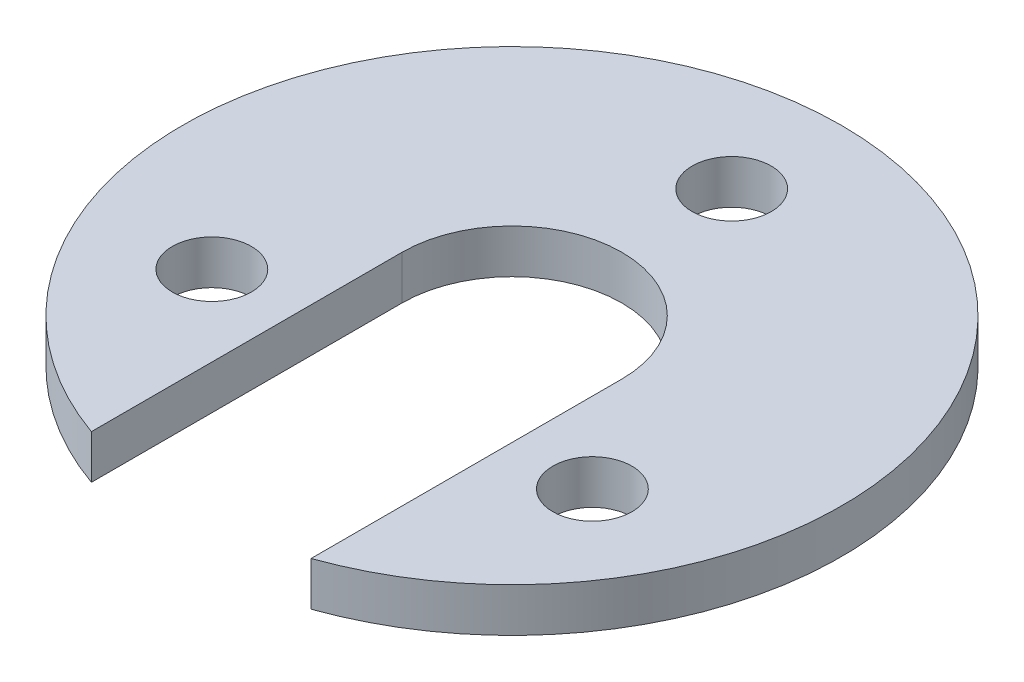
ISO-10303-21;
HEADER;
FILE_DESCRIPTION(('STEP AP214'),'2;1');
FILE_NAME('part.step','',(''),(''),'','','');
FILE_SCHEMA(('AUTOMOTIVE_DESIGN { 1 0 10303 214 1 1 1 1 }'));
ENDSEC;
DATA;
#1=APPLICATION_CONTEXT('core data for automotive mechanical design processes');
#2=APPLICATION_PROTOCOL_DEFINITION('international standard','automotive_design',2000,#1);
#3=PRODUCT_CONTEXT('',#1,'mechanical');
#4=PRODUCT('Part','Part','',(#3));
#5=PRODUCT_RELATED_PRODUCT_CATEGORY('part','',(#4));
#6=PRODUCT_DEFINITION_FORMATION('','',#4);
#7=PRODUCT_DEFINITION_CONTEXT('part definition',#1,'design');
#8=PRODUCT_DEFINITION('design','',#6,#7);
#9=PRODUCT_DEFINITION_SHAPE('','',#8);
#10=(LENGTH_UNIT() NAMED_UNIT(*) SI_UNIT(.MILLI.,.METRE.));
#11=(NAMED_UNIT(*) PLANE_ANGLE_UNIT() SI_UNIT($,.RADIAN.));
#12=(NAMED_UNIT(*) SI_UNIT($,.STERADIAN.) SOLID_ANGLE_UNIT());
#13=UNCERTAINTY_MEASURE_WITH_UNIT(LENGTH_MEASURE(1.E-05),#10,'distance_accuracy_value','');
#14=(GEOMETRIC_REPRESENTATION_CONTEXT(3) GLOBAL_UNCERTAINTY_ASSIGNED_CONTEXT((#13)) GLOBAL_UNIT_ASSIGNED_CONTEXT((#10,
#11,#12)) REPRESENTATION_CONTEXT('',''));
#15=CARTESIAN_POINT('',(0.,0.,0.));
#16=DIRECTION('',(0.,0.,1.));
#17=DIRECTION('',(1.,0.,0.));
#18=AXIS2_PLACEMENT_3D('',#15,#16,#17);
#19=CARTESIAN_POINT('',(0.,10.,0.));
#20=DIRECTION('',(0.,1.,0.));
#21=DIRECTION('',(0.,0.,1.));
#22=AXIS2_PLACEMENT_3D('',#19,#20,#21);
#23=PLANE('',#22);
#24=CARTESIAN_POINT('',(43.3012701892243,10.,24.9999999999986));
#25=DIRECTION('',(0.,1.,0.));
#26=DIRECTION('',(0.,0.,1.));
#27=AXIS2_PLACEMENT_3D('',#24,#25,#26);
#28=CIRCLE('',#27,9.00000000000001);
#29=CARTESIAN_POINT('',(43.3012701892243,10.,33.9999999999986));
#30=VERTEX_POINT('',#29);
#31=EDGE_CURVE('E136',#30,#30,#28,.T.);
#32=ORIENTED_EDGE('',*,*,#31,.F.);
#33=EDGE_LOOP('',(#32));
#34=FACE_BOUND('',#33,.T.);
#35=CARTESIAN_POINT('',(0.,10.,0.));
#36=DIRECTION('',(0.,1.,0.));
#37=DIRECTION('',(0.,0.,1.));
#38=AXIS2_PLACEMENT_3D('',#35,#36,#37);
#39=CIRCLE('',#38,75.);
#40=CARTESIAN_POINT('',(25.,10.,70.7106781186548));
#41=VERTEX_POINT('',#40);
#42=CARTESIAN_POINT('',(-25.,10.,70.7106781186548));
#43=VERTEX_POINT('',#42);
#44=EDGE_CURVE('E94',#41,#43,#39,.T.);
#45=ORIENTED_EDGE('',*,*,#44,.T.);
#46=DIRECTION('',(0.,0.,-1.));
#47=VECTOR('',#46,1.);
#48=CARTESIAN_POINT('',(-25.,10.,0.));
#49=LINE('',#48,#47);
#50=CARTESIAN_POINT('',(-25.,10.,0.));
#51=VERTEX_POINT('',#50);
#52=EDGE_CURVE('E89',#43,#51,#49,.T.);
#53=ORIENTED_EDGE('',*,*,#52,.T.);
#54=CARTESIAN_POINT('',(0.,10.,0.));
#55=DIRECTION('',(0.,-1.,0.));
#56=DIRECTION('',(0.,0.,1.));
#57=AXIS2_PLACEMENT_3D('',#54,#55,#56);
#58=CIRCLE('',#57,25.);
#59=CARTESIAN_POINT('',(25.,10.,0.));
#60=VERTEX_POINT('',#59);
#61=EDGE_CURVE('E92',#51,#60,#58,.T.);
#62=ORIENTED_EDGE('',*,*,#61,.T.);
#63=DIRECTION('',(0.,0.,1.));
#64=VECTOR('',#63,1.);
#65=CARTESIAN_POINT('',(25.,10.,0.));
#66=LINE('',#65,#64);
#67=EDGE_CURVE('E59',#60,#41,#66,.T.);
#68=ORIENTED_EDGE('',*,*,#67,.T.);
#69=EDGE_LOOP('',(#45,#53,#62,#68));
#70=FACE_BOUND('',#69,.T.);
#71=CARTESIAN_POINT('',(0.,10.,-50.));
#72=DIRECTION('',(0.,1.,0.));
#73=DIRECTION('',(0.,0.,1.));
#74=AXIS2_PLACEMENT_3D('',#71,#72,#73);
#75=CIRCLE('',#74,9.);
#76=CARTESIAN_POINT('',(0.,10.,-41.));
#77=VERTEX_POINT('',#76);
#78=EDGE_CURVE('E114',#77,#77,#75,.T.);
#79=ORIENTED_EDGE('',*,*,#78,.F.);
#80=EDGE_LOOP('',(#79));
#81=FACE_BOUND('',#80,.T.);
#82=CARTESIAN_POINT('',(-43.3012701892195,10.,25.0000000000014));
#83=DIRECTION('',(0.,1.,0.));
#84=DIRECTION('',(0.,0.,1.));
#85=AXIS2_PLACEMENT_3D('',#82,#83,#84);
#86=CIRCLE('',#85,9.);
#87=CARTESIAN_POINT('',(-43.3012701892195,10.,34.0000000000014));
#88=VERTEX_POINT('',#87);
#89=EDGE_CURVE('E144',#88,#88,#86,.T.);
#90=ORIENTED_EDGE('',*,*,#89,.F.);
#91=EDGE_LOOP('',(#90));
#92=FACE_BOUND('',#91,.T.);
#93=ADVANCED_FACE('F41',(#34,#70,#81,#92),#23,.T.);
#94=CARTESIAN_POINT('',(0.,0.,0.));
#95=DIRECTION('',(0.,1.,0.));
#96=DIRECTION('',(0.,0.,1.));
#97=AXIS2_PLACEMENT_3D('',#94,#95,#96);
#98=PLANE('',#97);
#99=CARTESIAN_POINT('',(0.,0.,0.));
#100=DIRECTION('',(0.,1.,0.));
#101=DIRECTION('',(0.,0.,1.));
#102=AXIS2_PLACEMENT_3D('',#99,#100,#101);
#103=CIRCLE('',#102,75.);
#104=CARTESIAN_POINT('',(25.,0.,70.7106781186548));
#105=VERTEX_POINT('',#104);
#106=CARTESIAN_POINT('',(-25.,0.,70.7106781186548));
#107=VERTEX_POINT('',#106);
#108=EDGE_CURVE('E110',#105,#107,#103,.T.);
#109=ORIENTED_EDGE('',*,*,#108,.F.);
#110=DIRECTION('',(0.,0.,1.));
#111=VECTOR('',#110,1.);
#112=CARTESIAN_POINT('',(25.,0.,0.));
#113=LINE('',#112,#111);
#114=CARTESIAN_POINT('',(25.,0.,0.));
#115=VERTEX_POINT('',#114);
#116=EDGE_CURVE('E82',#115,#105,#113,.T.);
#117=ORIENTED_EDGE('',*,*,#116,.F.);
#118=CARTESIAN_POINT('',(0.,0.,0.));
#119=DIRECTION('',(0.,-1.,0.));
#120=DIRECTION('',(0.,0.,1.));
#121=AXIS2_PLACEMENT_3D('',#118,#119,#120);
#122=CIRCLE('',#121,25.);
#123=CARTESIAN_POINT('',(-25.,0.,0.));
#124=VERTEX_POINT('',#123);
#125=EDGE_CURVE('E76',#124,#115,#122,.T.);
#126=ORIENTED_EDGE('',*,*,#125,.F.);
#127=DIRECTION('',(0.,0.,-1.));
#128=VECTOR('',#127,1.);
#129=CARTESIAN_POINT('',(-25.,0.,0.));
#130=LINE('',#129,#128);
#131=EDGE_CURVE('E99',#107,#124,#130,.T.);
#132=ORIENTED_EDGE('',*,*,#131,.F.);
#133=EDGE_LOOP('',(#109,#117,#126,#132));
#134=FACE_BOUND('',#133,.T.);
#135=CARTESIAN_POINT('',(0.,0.,-50.));
#136=DIRECTION('',(0.,1.,0.));
#137=DIRECTION('',(0.,0.,1.));
#138=AXIS2_PLACEMENT_3D('',#135,#136,#137);
#139=CIRCLE('',#138,9.);
#140=CARTESIAN_POINT('',(0.,0.,-41.));
#141=VERTEX_POINT('',#140);
#142=EDGE_CURVE('E132',#141,#141,#139,.T.);
#143=ORIENTED_EDGE('',*,*,#142,.T.);
#144=EDGE_LOOP('',(#143));
#145=FACE_BOUND('',#144,.T.);
#146=CARTESIAN_POINT('',(43.3012701892243,0.,24.9999999999986));
#147=DIRECTION('',(0.,1.,0.));
#148=DIRECTION('',(0.,0.,1.));
#149=AXIS2_PLACEMENT_3D('',#146,#147,#148);
#150=CIRCLE('',#149,9.00000000000001);
#151=CARTESIAN_POINT('',(43.3012701892243,0.,33.9999999999986));
#152=VERTEX_POINT('',#151);
#153=EDGE_CURVE('E140',#152,#152,#150,.T.);
#154=ORIENTED_EDGE('',*,*,#153,.T.);
#155=EDGE_LOOP('',(#154));
#156=FACE_BOUND('',#155,.T.);
#157=CARTESIAN_POINT('',(-43.3012701892195,0.,25.0000000000014));
#158=DIRECTION('',(0.,1.,0.));
#159=DIRECTION('',(0.,0.,1.));
#160=AXIS2_PLACEMENT_3D('',#157,#158,#159);
#161=CIRCLE('',#160,9.);
#162=CARTESIAN_POINT('',(-43.3012701892195,0.,34.0000000000014));
#163=VERTEX_POINT('',#162);
#164=EDGE_CURVE('E148',#163,#163,#161,.T.);
#165=ORIENTED_EDGE('',*,*,#164,.T.);
#166=EDGE_LOOP('',(#165));
#167=FACE_BOUND('',#166,.T.);
#168=ADVANCED_FACE('F127',(#134,#145,#156,#167),#98,.F.);
#169=CARTESIAN_POINT('',(0.,10.,0.));
#170=DIRECTION('',(0.,-1.,0.));
#171=DIRECTION('',(0.,0.,-1.));
#172=AXIS2_PLACEMENT_3D('',#169,#170,#171);
#173=CYLINDRICAL_SURFACE('',#172,75.);
#174=ORIENTED_EDGE('',*,*,#108,.T.);
#175=DIRECTION('',(0.,-1.,0.));
#176=VECTOR('',#175,1.);
#177=CARTESIAN_POINT('',(-25.,10.,70.7106781186548));
#178=LINE('',#177,#176);
#179=EDGE_CURVE('E11',#43,#107,#178,.T.);
#180=ORIENTED_EDGE('',*,*,#179,.F.);
#181=ORIENTED_EDGE('',*,*,#44,.F.);
#182=DIRECTION('',(0.,-1.,0.));
#183=VECTOR('',#182,1.);
#184=CARTESIAN_POINT('',(25.,10.,70.7106781186548));
#185=LINE('',#184,#183);
#186=EDGE_CURVE('E106',#41,#105,#185,.T.);
#187=ORIENTED_EDGE('',*,*,#186,.T.);
#188=EDGE_LOOP('',(#174,#180,#181,#187));
#189=FACE_BOUND('',#188,.T.);
#190=ADVANCED_FACE('F43',(#189),#173,.T.);
#191=CARTESIAN_POINT('',(-25.,10.,0.));
#192=DIRECTION('',(-1.,0.,0.));
#193=DIRECTION('',(0.,0.,1.));
#194=AXIS2_PLACEMENT_3D('',#191,#192,#193);
#195=PLANE('',#194);
#196=ORIENTED_EDGE('',*,*,#131,.T.);
#197=DIRECTION('',(0.,-1.,0.));
#198=VECTOR('',#197,1.);
#199=CARTESIAN_POINT('',(-25.,10.,0.));
#200=LINE('',#199,#198);
#201=EDGE_CURVE('E51',#51,#124,#200,.T.);
#202=ORIENTED_EDGE('',*,*,#201,.F.);
#203=ORIENTED_EDGE('',*,*,#52,.F.);
#204=ORIENTED_EDGE('',*,*,#179,.T.);
#205=EDGE_LOOP('',(#196,#202,#203,#204));
#206=FACE_BOUND('',#205,.T.);
#207=ADVANCED_FACE('F98',(#206),#195,.F.);
#208=CARTESIAN_POINT('',(0.,10.,0.));
#209=DIRECTION('',(0.,-1.,0.));
#210=DIRECTION('',(0.,0.,-1.));
#211=AXIS2_PLACEMENT_3D('',#208,#209,#210);
#212=CYLINDRICAL_SURFACE('',#211,25.);
#213=ORIENTED_EDGE('',*,*,#125,.T.);
#214=DIRECTION('',(0.,-1.,0.));
#215=VECTOR('',#214,1.);
#216=CARTESIAN_POINT('',(25.,10.,0.));
#217=LINE('',#216,#215);
#218=EDGE_CURVE('E101',#60,#115,#217,.T.);
#219=ORIENTED_EDGE('',*,*,#218,.F.);
#220=ORIENTED_EDGE('',*,*,#61,.F.);
#221=ORIENTED_EDGE('',*,*,#201,.T.);
#222=EDGE_LOOP('',(#213,#219,#220,#221));
#223=FACE_BOUND('',#222,.T.);
#224=ADVANCED_FACE('F102',(#223),#212,.F.);
#225=CARTESIAN_POINT('',(25.,10.,0.));
#226=DIRECTION('',(1.,0.,0.));
#227=DIRECTION('',(0.,0.,-1.));
#228=AXIS2_PLACEMENT_3D('',#225,#226,#227);
#229=PLANE('',#228);
#230=ORIENTED_EDGE('',*,*,#116,.T.);
#231=ORIENTED_EDGE('',*,*,#186,.F.);
#232=ORIENTED_EDGE('',*,*,#67,.F.);
#233=ORIENTED_EDGE('',*,*,#218,.T.);
#234=EDGE_LOOP('',(#230,#231,#232,#233));
#235=FACE_BOUND('',#234,.T.);
#236=ADVANCED_FACE('F124',(#235),#229,.F.);
#237=CARTESIAN_POINT('',(0.,10.,-50.));
#238=DIRECTION('',(0.,-1.,0.));
#239=DIRECTION('',(0.,0.,-1.));
#240=AXIS2_PLACEMENT_3D('',#237,#238,#239);
#241=CYLINDRICAL_SURFACE('',#240,9.);
#242=ORIENTED_EDGE('',*,*,#78,.T.);
#243=EDGE_LOOP('',(#242));
#244=FACE_BOUND('',#243,.T.);
#245=ORIENTED_EDGE('',*,*,#142,.F.);
#246=EDGE_LOOP('',(#245));
#247=FACE_BOUND('',#246,.T.);
#248=ADVANCED_FACE('F168',(#244,#247),#241,.F.);
#249=CARTESIAN_POINT('',(43.3012701892243,10.,24.9999999999986));
#250=DIRECTION('',(0.,-1.,0.));
#251=DIRECTION('',(0.,0.,-1.));
#252=AXIS2_PLACEMENT_3D('',#249,#250,#251);
#253=CYLINDRICAL_SURFACE('',#252,9.00000000000001);
#254=ORIENTED_EDGE('',*,*,#31,.T.);
#255=EDGE_LOOP('',(#254));
#256=FACE_BOUND('',#255,.T.);
#257=ORIENTED_EDGE('',*,*,#153,.F.);
#258=EDGE_LOOP('',(#257));
#259=FACE_BOUND('',#258,.T.);
#260=ADVANCED_FACE('F223',(#256,#259),#253,.F.);
#261=CARTESIAN_POINT('',(-43.3012701892195,10.,25.0000000000014));
#262=DIRECTION('',(0.,-1.,0.));
#263=DIRECTION('',(0.,0.,-1.));
#264=AXIS2_PLACEMENT_3D('',#261,#262,#263);
#265=CYLINDRICAL_SURFACE('',#264,9.);
#266=ORIENTED_EDGE('',*,*,#89,.T.);
#267=EDGE_LOOP('',(#266));
#268=FACE_BOUND('',#267,.T.);
#269=ORIENTED_EDGE('',*,*,#164,.F.);
#270=EDGE_LOOP('',(#269));
#271=FACE_BOUND('',#270,.T.);
#272=ADVANCED_FACE('F156',(#268,#271),#265,.F.);
#273=CLOSED_SHELL('',(#93,#168,#190,#207,#224,#236,#248,#260,#272));
#274=MANIFOLD_SOLID_BREP('B2',#273);
#275=ADVANCED_BREP_SHAPE_REPRESENTATION('',(#18,#274),#14);
#276=SHAPE_DEFINITION_REPRESENTATION(#9,#275);
ENDSEC;
END-ISO-10303-21;
